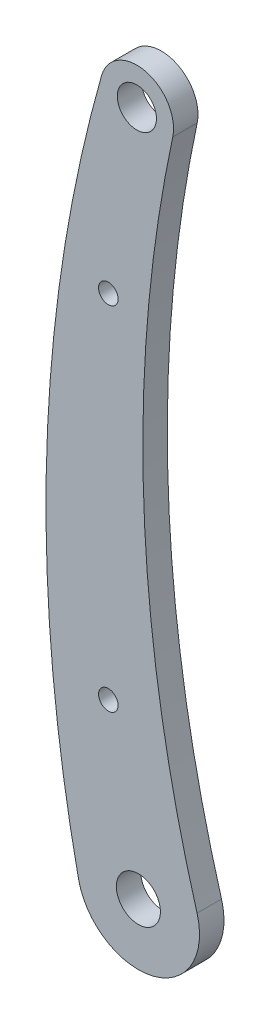
ISO-10303-21;
HEADER;
FILE_DESCRIPTION(('STEP AP214'),'2;1');
FILE_NAME('part.step','',(''),(''),'','','');
FILE_SCHEMA(('AUTOMOTIVE_DESIGN { 1 0 10303 214 1 1 1 1 }'));
ENDSEC;
DATA;
#1=APPLICATION_CONTEXT('core data for automotive mechanical design processes');
#2=APPLICATION_PROTOCOL_DEFINITION('international standard','automotive_design',2000,#1);
#3=PRODUCT_CONTEXT('',#1,'mechanical');
#4=PRODUCT('Part','Part','',(#3));
#5=PRODUCT_RELATED_PRODUCT_CATEGORY('part','',(#4));
#6=PRODUCT_DEFINITION_FORMATION('','',#4);
#7=PRODUCT_DEFINITION_CONTEXT('part definition',#1,'design');
#8=PRODUCT_DEFINITION('design','',#6,#7);
#9=PRODUCT_DEFINITION_SHAPE('','',#8);
#10=(LENGTH_UNIT() NAMED_UNIT(*) SI_UNIT(.MILLI.,.METRE.));
#11=(NAMED_UNIT(*) PLANE_ANGLE_UNIT() SI_UNIT($,.RADIAN.));
#12=(NAMED_UNIT(*) SI_UNIT($,.STERADIAN.) SOLID_ANGLE_UNIT());
#13=UNCERTAINTY_MEASURE_WITH_UNIT(LENGTH_MEASURE(1.E-05),#10,'distance_accuracy_value','');
#14=(GEOMETRIC_REPRESENTATION_CONTEXT(3) GLOBAL_UNCERTAINTY_ASSIGNED_CONTEXT((#13)) GLOBAL_UNIT_ASSIGNED_CONTEXT((#10,
#11,#12)) REPRESENTATION_CONTEXT('',''));
#15=CARTESIAN_POINT('',(0.,0.,0.));
#16=DIRECTION('',(0.,0.,1.));
#17=DIRECTION('',(1.,0.,0.));
#18=AXIS2_PLACEMENT_3D('',#15,#16,#17);
#19=CARTESIAN_POINT('',(137.957829025341,40.3943054231007,5.));
#20=DIRECTION('',(0.,0.,1.));
#21=DIRECTION('',(1.,0.,0.));
#22=AXIS2_PLACEMENT_3D('',#19,#20,#21);
#23=PLANE('',#22);
#24=CARTESIAN_POINT('',(-6.14211543162091,32.2137494634089,5.));
#25=DIRECTION('',(0.,0.,1.));
#26=DIRECTION('',(1.,0.,0.));
#27=AXIS2_PLACEMENT_3D('',#24,#25,#26);
#28=CIRCLE('',#27,2.);
#29=CARTESIAN_POINT('',(-4.14211543162091,32.2137494634089,5.));
#30=VERTEX_POINT('',#29);
#31=EDGE_CURVE('E121',#30,#30,#28,.T.);
#32=ORIENTED_EDGE('',*,*,#31,.F.);
#33=EDGE_LOOP('',(#32));
#34=FACE_BOUND('',#33,.T.);
#35=CARTESIAN_POINT('',(-6.14211543162091,104.166670734742,5.));
#36=DIRECTION('',(0.,0.,1.));
#37=DIRECTION('',(1.,0.,0.));
#38=AXIS2_PLACEMENT_3D('',#35,#36,#37);
#39=CIRCLE('',#38,2.);
#40=CARTESIAN_POINT('',(-4.14211543162091,104.166670734742,5.));
#41=VERTEX_POINT('',#40);
#42=EDGE_CURVE('E110',#41,#41,#39,.T.);
#43=ORIENTED_EDGE('',*,*,#42,.F.);
#44=EDGE_LOOP('',(#43));
#45=FACE_BOUND('',#44,.T.);
#46=CARTESIAN_POINT('',(0.,0.,5.));
#47=DIRECTION('',(0.,0.,1.));
#48=DIRECTION('',(1.,0.,0.));
#49=AXIS2_PLACEMENT_3D('',#46,#47,#48);
#50=CIRCLE('',#49,4.5);
#51=CARTESIAN_POINT('',(4.5,0.,5.));
#52=VERTEX_POINT('',#51);
#53=EDGE_CURVE('E102',#52,#52,#50,.T.);
#54=ORIENTED_EDGE('',*,*,#53,.F.);
#55=EDGE_LOOP('',(#54));
#56=FACE_BOUND('',#55,.T.);
#57=CARTESIAN_POINT('',(275.915658050682,80.7886108462015,5.));
#58=DIRECTION('',(0.,0.,-1.));
#59=DIRECTION('',(1.,0.,0.));
#60=AXIS2_PLACEMENT_3D('',#57,#58,#59);
#61=CIRCLE('',#60,275.);
#62=CARTESIAN_POINT('',(11.9963329587253,3.51254829766093,5.));
#63=VERTEX_POINT('',#62);
#64=CARTESIAN_POINT('',(7.02397479696329,138.42768333164,5.));
#65=VERTEX_POINT('',#64);
#66=EDGE_CURVE('E86',#63,#65,#61,.T.);
#67=ORIENTED_EDGE('',*,*,#66,.T.);
#68=CARTESIAN_POINT('',(-0.309434746319955,139.999658035789,5.));
#69=DIRECTION('',(0.,0.,1.));
#70=DIRECTION('',(1.,0.,0.));
#71=AXIS2_PLACEMENT_3D('',#68,#69,#70);
#72=CIRCLE('',#71,7.5);
#73=CARTESIAN_POINT('',(-7.52539193567164,142.044153533814,5.));
#74=VERTEX_POINT('',#73);
#75=EDGE_CURVE('E81',#65,#74,#72,.T.);
#76=ORIENTED_EDGE('',*,*,#75,.T.);
#77=CARTESIAN_POINT('',(281.112895638395,60.2643336128175,5.));
#78=DIRECTION('',(0.,0.,1.));
#79=DIRECTION('',(1.,0.,0.));
#80=AXIS2_PLACEMENT_3D('',#77,#78,#79);
#81=CIRCLE('',#80,300.);
#82=CARTESIAN_POINT('',(-12.222299810365,-2.62018841794858,5.));
#83=VERTEX_POINT('',#82);
#84=EDGE_CURVE('E84',#74,#83,#81,.T.);
#85=ORIENTED_EDGE('',*,*,#84,.T.);
#86=CARTESIAN_POINT('',(0.,0.,5.));
#87=DIRECTION('',(0.,0.,1.));
#88=DIRECTION('',(1.,0.,0.));
#89=AXIS2_PLACEMENT_3D('',#86,#87,#88);
#90=CIRCLE('',#89,12.5);
#91=EDGE_CURVE('E51',#83,#63,#90,.T.);
#92=ORIENTED_EDGE('',*,*,#91,.T.);
#93=EDGE_LOOP('',(#67,#76,#85,#92));
#94=FACE_BOUND('',#93,.T.);
#95=CARTESIAN_POINT('',(-0.309434746319955,139.999658035789,5.));
#96=DIRECTION('',(0.,0.,1.));
#97=DIRECTION('',(1.,0.,0.));
#98=AXIS2_PLACEMENT_3D('',#95,#96,#97);
#99=CIRCLE('',#98,4.);
#100=CARTESIAN_POINT('',(3.69056525368005,139.999658035789,5.));
#101=VERTEX_POINT('',#100);
#102=EDGE_CURVE('E114',#101,#101,#99,.T.);
#103=ORIENTED_EDGE('',*,*,#102,.F.);
#104=EDGE_LOOP('',(#103));
#105=FACE_BOUND('',#104,.T.);
#106=ADVANCED_FACE('F32',(#34,#45,#56,#94,#105),#23,.T.);
#107=CARTESIAN_POINT('',(137.957829025341,40.3943054231007,0.));
#108=DIRECTION('',(0.,0.,1.));
#109=DIRECTION('',(1.,0.,0.));
#110=AXIS2_PLACEMENT_3D('',#107,#108,#109);
#111=PLANE('',#110);
#112=CARTESIAN_POINT('',(-6.14211543162091,32.2137494634089,0.));
#113=DIRECTION('',(0.,0.,1.));
#114=DIRECTION('',(1.,0.,0.));
#115=AXIS2_PLACEMENT_3D('',#112,#113,#114);
#116=CIRCLE('',#115,2.);
#117=CARTESIAN_POINT('',(-4.14211543162091,32.2137494634089,0.));
#118=VERTEX_POINT('',#117);
#119=EDGE_CURVE('E36',#118,#118,#116,.T.);
#120=ORIENTED_EDGE('',*,*,#119,.T.);
#121=EDGE_LOOP('',(#120));
#122=FACE_BOUND('',#121,.T.);
#123=CARTESIAN_POINT('',(-6.14211543162091,104.166670734742,0.));
#124=DIRECTION('',(0.,0.,1.));
#125=DIRECTION('',(1.,0.,0.));
#126=AXIS2_PLACEMENT_3D('',#123,#124,#125);
#127=CIRCLE('',#126,2.);
#128=CARTESIAN_POINT('',(-4.14211543162091,104.166670734742,0.));
#129=VERTEX_POINT('',#128);
#130=EDGE_CURVE('E107',#129,#129,#127,.T.);
#131=ORIENTED_EDGE('',*,*,#130,.T.);
#132=EDGE_LOOP('',(#131));
#133=FACE_BOUND('',#132,.T.);
#134=CARTESIAN_POINT('',(0.,0.,0.));
#135=DIRECTION('',(0.,0.,1.));
#136=DIRECTION('',(1.,0.,0.));
#137=AXIS2_PLACEMENT_3D('',#134,#135,#136);
#138=CIRCLE('',#137,4.5);
#139=CARTESIAN_POINT('',(4.5,0.,0.));
#140=VERTEX_POINT('',#139);
#141=EDGE_CURVE('E125',#140,#140,#138,.T.);
#142=ORIENTED_EDGE('',*,*,#141,.T.);
#143=EDGE_LOOP('',(#142));
#144=FACE_BOUND('',#143,.T.);
#145=CARTESIAN_POINT('',(275.915658050682,80.7886108462015,0.));
#146=DIRECTION('',(0.,0.,-1.));
#147=DIRECTION('',(1.,0.,0.));
#148=AXIS2_PLACEMENT_3D('',#145,#146,#147);
#149=CIRCLE('',#148,275.);
#150=CARTESIAN_POINT('',(11.9963329587253,3.51254829766093,0.));
#151=VERTEX_POINT('',#150);
#152=CARTESIAN_POINT('',(7.02397479696329,138.42768333164,0.));
#153=VERTEX_POINT('',#152);
#154=EDGE_CURVE('E99',#151,#153,#149,.T.);
#155=ORIENTED_EDGE('',*,*,#154,.F.);
#156=CARTESIAN_POINT('',(0.,0.,0.));
#157=DIRECTION('',(0.,0.,1.));
#158=DIRECTION('',(1.,0.,0.));
#159=AXIS2_PLACEMENT_3D('',#156,#157,#158);
#160=CIRCLE('',#159,12.5);
#161=CARTESIAN_POINT('',(-12.222299810365,-2.62018841794858,0.));
#162=VERTEX_POINT('',#161);
#163=EDGE_CURVE('E74',#162,#151,#160,.T.);
#164=ORIENTED_EDGE('',*,*,#163,.F.);
#165=CARTESIAN_POINT('',(281.112895638395,60.2643336128175,0.));
#166=DIRECTION('',(0.,0.,1.));
#167=DIRECTION('',(1.,0.,0.));
#168=AXIS2_PLACEMENT_3D('',#165,#166,#167);
#169=CIRCLE('',#168,300.);
#170=CARTESIAN_POINT('',(-7.52539193567164,142.044153533814,0.));
#171=VERTEX_POINT('',#170);
#172=EDGE_CURVE('E68',#171,#162,#169,.T.);
#173=ORIENTED_EDGE('',*,*,#172,.F.);
#174=CARTESIAN_POINT('',(-0.309434746319955,139.999658035789,0.));
#175=DIRECTION('',(0.,0.,1.));
#176=DIRECTION('',(1.,0.,0.));
#177=AXIS2_PLACEMENT_3D('',#174,#175,#176);
#178=CIRCLE('',#177,7.5);
#179=EDGE_CURVE('E90',#153,#171,#178,.T.);
#180=ORIENTED_EDGE('',*,*,#179,.F.);
#181=EDGE_LOOP('',(#155,#164,#173,#180));
#182=FACE_BOUND('',#181,.T.);
#183=CARTESIAN_POINT('',(-0.309434746319955,139.999658035789,0.));
#184=DIRECTION('',(0.,0.,1.));
#185=DIRECTION('',(1.,0.,0.));
#186=AXIS2_PLACEMENT_3D('',#183,#184,#185);
#187=CIRCLE('',#186,4.);
#188=CARTESIAN_POINT('',(3.69056525368005,139.999658035789,0.));
#189=VERTEX_POINT('',#188);
#190=EDGE_CURVE('E109',#189,#189,#187,.T.);
#191=ORIENTED_EDGE('',*,*,#190,.T.);
#192=EDGE_LOOP('',(#191));
#193=FACE_BOUND('',#192,.T.);
#194=ADVANCED_FACE('F132',(#122,#133,#144,#182,#193),#111,.F.);
#195=CARTESIAN_POINT('',(275.915658050682,80.7886108462015,5.));
#196=DIRECTION('',(0.,0.,-1.));
#197=DIRECTION('',(-1.,0.,0.));
#198=AXIS2_PLACEMENT_3D('',#195,#196,#197);
#199=CYLINDRICAL_SURFACE('',#198,275.);
#200=ORIENTED_EDGE('',*,*,#154,.T.);
#201=DIRECTION('',(0.,0.,-1.));
#202=VECTOR('',#201,1.);
#203=CARTESIAN_POINT('',(7.02397479696329,138.42768333164,5.));
#204=LINE('',#203,#202);
#205=EDGE_CURVE('E11',#65,#153,#204,.T.);
#206=ORIENTED_EDGE('',*,*,#205,.F.);
#207=ORIENTED_EDGE('',*,*,#66,.F.);
#208=DIRECTION('',(0.,0.,-1.));
#209=VECTOR('',#208,1.);
#210=CARTESIAN_POINT('',(11.9963329587253,3.51254829766093,5.));
#211=LINE('',#210,#209);
#212=EDGE_CURVE('E95',#63,#151,#211,.T.);
#213=ORIENTED_EDGE('',*,*,#212,.T.);
#214=EDGE_LOOP('',(#200,#206,#207,#213));
#215=FACE_BOUND('',#214,.T.);
#216=ADVANCED_FACE('F34',(#215),#199,.F.);
#217=CARTESIAN_POINT('',(-0.309434746319955,139.999658035789,5.));
#218=DIRECTION('',(0.,0.,-1.));
#219=DIRECTION('',(-1.,0.,0.));
#220=AXIS2_PLACEMENT_3D('',#217,#218,#219);
#221=CYLINDRICAL_SURFACE('',#220,7.5);
#222=ORIENTED_EDGE('',*,*,#179,.T.);
#223=DIRECTION('',(0.,0.,-1.));
#224=VECTOR('',#223,1.);
#225=CARTESIAN_POINT('',(-7.52539193567164,142.044153533814,5.));
#226=LINE('',#225,#224);
#227=EDGE_CURVE('E42',#74,#171,#226,.T.);
#228=ORIENTED_EDGE('',*,*,#227,.F.);
#229=ORIENTED_EDGE('',*,*,#75,.F.);
#230=ORIENTED_EDGE('',*,*,#205,.T.);
#231=EDGE_LOOP('',(#222,#228,#229,#230));
#232=FACE_BOUND('',#231,.T.);
#233=ADVANCED_FACE('F89',(#232),#221,.T.);
#234=CARTESIAN_POINT('',(281.112895638395,60.2643336128175,5.));
#235=DIRECTION('',(0.,0.,-1.));
#236=DIRECTION('',(-1.,0.,0.));
#237=AXIS2_PLACEMENT_3D('',#234,#235,#236);
#238=CYLINDRICAL_SURFACE('',#237,300.);
#239=ORIENTED_EDGE('',*,*,#172,.T.);
#240=DIRECTION('',(0.,0.,-1.));
#241=VECTOR('',#240,1.);
#242=CARTESIAN_POINT('',(-12.222299810365,-2.62018841794858,5.));
#243=LINE('',#242,#241);
#244=EDGE_CURVE('E91',#83,#162,#243,.T.);
#245=ORIENTED_EDGE('',*,*,#244,.F.);
#246=ORIENTED_EDGE('',*,*,#84,.F.);
#247=ORIENTED_EDGE('',*,*,#227,.T.);
#248=EDGE_LOOP('',(#239,#245,#246,#247));
#249=FACE_BOUND('',#248,.T.);
#250=ADVANCED_FACE('F93',(#249),#238,.T.);
#251=CARTESIAN_POINT('',(0.,0.,5.));
#252=DIRECTION('',(0.,0.,-1.));
#253=DIRECTION('',(-1.,0.,0.));
#254=AXIS2_PLACEMENT_3D('',#251,#252,#253);
#255=CYLINDRICAL_SURFACE('',#254,12.5);
#256=ORIENTED_EDGE('',*,*,#163,.T.);
#257=ORIENTED_EDGE('',*,*,#212,.F.);
#258=ORIENTED_EDGE('',*,*,#91,.F.);
#259=ORIENTED_EDGE('',*,*,#244,.T.);
#260=EDGE_LOOP('',(#256,#257,#258,#259));
#261=FACE_BOUND('',#260,.T.);
#262=ADVANCED_FACE('F138',(#261),#255,.T.);
#263=CARTESIAN_POINT('',(0.,0.,5.));
#264=DIRECTION('',(0.,0.,-1.));
#265=DIRECTION('',(-1.,0.,0.));
#266=AXIS2_PLACEMENT_3D('',#263,#264,#265);
#267=CYLINDRICAL_SURFACE('',#266,4.5);
#268=ORIENTED_EDGE('',*,*,#53,.T.);
#269=EDGE_LOOP('',(#268));
#270=FACE_BOUND('',#269,.T.);
#271=ORIENTED_EDGE('',*,*,#141,.F.);
#272=EDGE_LOOP('',(#271));
#273=FACE_BOUND('',#272,.T.);
#274=ADVANCED_FACE('F135',(#270,#273),#267,.F.);
#275=CARTESIAN_POINT('',(-0.309434746319955,139.999658035789,5.));
#276=DIRECTION('',(0.,0.,-1.));
#277=DIRECTION('',(-1.,0.,0.));
#278=AXIS2_PLACEMENT_3D('',#275,#276,#277);
#279=CYLINDRICAL_SURFACE('',#278,4.);
#280=ORIENTED_EDGE('',*,*,#102,.T.);
#281=EDGE_LOOP('',(#280));
#282=FACE_BOUND('',#281,.T.);
#283=ORIENTED_EDGE('',*,*,#190,.F.);
#284=EDGE_LOOP('',(#283));
#285=FACE_BOUND('',#284,.T.);
#286=ADVANCED_FACE('F137',(#282,#285),#279,.F.);
#287=CARTESIAN_POINT('',(-6.14211543162091,104.166670734742,-20.));
#288=DIRECTION('',(0.,0.,1.));
#289=DIRECTION('',(1.,0.,0.));
#290=AXIS2_PLACEMENT_3D('',#287,#288,#289);
#291=CYLINDRICAL_SURFACE('',#290,2.);
#292=ORIENTED_EDGE('',*,*,#42,.T.);
#293=EDGE_LOOP('',(#292));
#294=FACE_BOUND('',#293,.T.);
#295=ORIENTED_EDGE('',*,*,#130,.F.);
#296=EDGE_LOOP('',(#295));
#297=FACE_BOUND('',#296,.T.);
#298=ADVANCED_FACE('F145',(#294,#297),#291,.F.);
#299=CARTESIAN_POINT('',(-6.14211543162091,32.2137494634089,-20.));
#300=DIRECTION('',(0.,0.,1.));
#301=DIRECTION('',(1.,0.,0.));
#302=AXIS2_PLACEMENT_3D('',#299,#300,#301);
#303=CYLINDRICAL_SURFACE('',#302,2.);
#304=ORIENTED_EDGE('',*,*,#31,.T.);
#305=EDGE_LOOP('',(#304));
#306=FACE_BOUND('',#305,.T.);
#307=ORIENTED_EDGE('',*,*,#119,.F.);
#308=EDGE_LOOP('',(#307));
#309=FACE_BOUND('',#308,.T.);
#310=ADVANCED_FACE('F188',(#306,#309),#303,.F.);
#311=CLOSED_SHELL('',(#106,#194,#216,#233,#250,#262,#274,#286,#298,#310));
#312=MANIFOLD_SOLID_BREP('B2',#311);
#313=ADVANCED_BREP_SHAPE_REPRESENTATION('',(#18,#312),#14);
#314=SHAPE_DEFINITION_REPRESENTATION(#9,#313);
ENDSEC;
END-ISO-10303-21;
